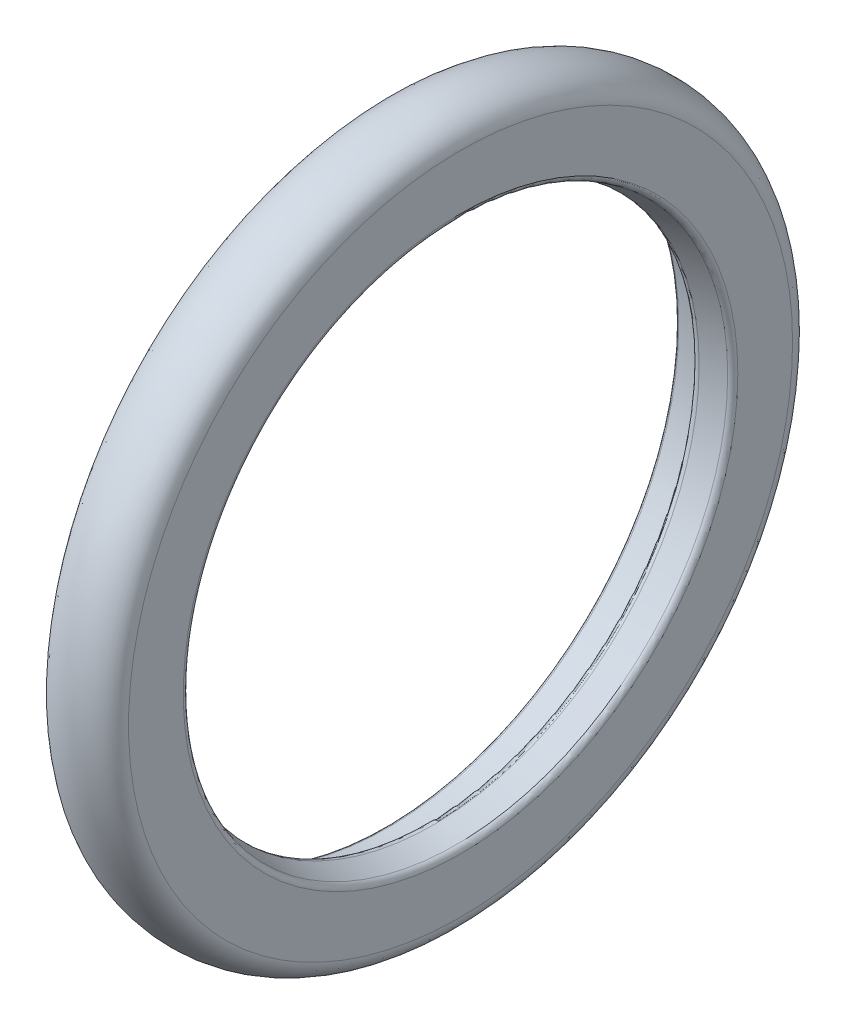
ISO-10303-21;
HEADER;
FILE_DESCRIPTION(('STEP AP214'),'2;1');
FILE_NAME('part.step','',(''),(''),'','','');
FILE_SCHEMA(('AUTOMOTIVE_DESIGN { 1 0 10303 214 1 1 1 1 }'));
ENDSEC;
DATA;
#1=APPLICATION_CONTEXT('core data for automotive mechanical design processes');
#2=APPLICATION_PROTOCOL_DEFINITION('international standard','automotive_design',2000,#1);
#3=PRODUCT_CONTEXT('',#1,'mechanical');
#4=PRODUCT('Part','Part','',(#3));
#5=PRODUCT_RELATED_PRODUCT_CATEGORY('part','',(#4));
#6=PRODUCT_DEFINITION_FORMATION('','',#4);
#7=PRODUCT_DEFINITION_CONTEXT('part definition',#1,'design');
#8=PRODUCT_DEFINITION('design','',#6,#7);
#9=PRODUCT_DEFINITION_SHAPE('','',#8);
#10=(LENGTH_UNIT() NAMED_UNIT(*) SI_UNIT(.MILLI.,.METRE.));
#11=(NAMED_UNIT(*) PLANE_ANGLE_UNIT() SI_UNIT($,.RADIAN.));
#12=(NAMED_UNIT(*) SI_UNIT($,.STERADIAN.) SOLID_ANGLE_UNIT());
#13=UNCERTAINTY_MEASURE_WITH_UNIT(LENGTH_MEASURE(1.E-05),#10,'distance_accuracy_value','');
#14=(GEOMETRIC_REPRESENTATION_CONTEXT(3) GLOBAL_UNCERTAINTY_ASSIGNED_CONTEXT((#13)) GLOBAL_UNIT_ASSIGNED_CONTEXT((#10,
#11,#12)) REPRESENTATION_CONTEXT('',''));
#15=CARTESIAN_POINT('',(0.,0.,0.));
#16=DIRECTION('',(0.,0.,1.));
#17=DIRECTION('',(1.,0.,0.));
#18=AXIS2_PLACEMENT_3D('',#15,#16,#17);
#19=CARTESIAN_POINT('',(-0.558663493989481,0.,0.));
#20=DIRECTION('',(1.,0.,0.));
#21=DIRECTION('',(0.,0.,-1.));
#22=AXIS2_PLACEMENT_3D('',#19,#20,#21);
#23=TOROIDAL_SURFACE('',#22,24.,0.5);
#24=CARTESIAN_POINT('',(-0.0757005808449396,0.,0.));
#25=DIRECTION('',(1.,0.,0.));
#26=DIRECTION('',(0.,0.,-1.));
#27=AXIS2_PLACEMENT_3D('',#24,#25,#26);
#28=CIRCLE('',#27,24.1294095225513);
#29=CARTESIAN_POINT('',(-0.0757005808449396,0.,-24.1294095225513));
#30=VERTEX_POINT('',#29);
#31=EDGE_CURVE('E86',#30,#30,#28,.T.);
#32=ORIENTED_EDGE('',*,*,#31,.T.);
#33=EDGE_LOOP('',(#32));
#34=FACE_BOUND('',#33,.T.);
#35=CARTESIAN_POINT('',(-0.558663493989489,0.,0.));
#36=DIRECTION('',(1.,0.,0.));
#37=DIRECTION('',(0.,0.,-1.));
#38=AXIS2_PLACEMENT_3D('',#35,#36,#37);
#39=CIRCLE('',#38,24.5);
#40=CARTESIAN_POINT('',(-0.558663493989489,0.,-24.5));
#41=VERTEX_POINT('',#40);
#42=EDGE_CURVE('E10',#41,#41,#39,.T.);
#43=ORIENTED_EDGE('',*,*,#42,.F.);
#44=EDGE_LOOP('',(#43));
#45=FACE_BOUND('',#44,.T.);
#46=ADVANCED_FACE('F43',(#34,#45),#23,.F.);
#47=CARTESIAN_POINT('',(88.99,0.,0.));
#48=DIRECTION('',(1.,0.,0.));
#49=DIRECTION('',(0.,0.,-1.));
#50=AXIS2_PLACEMENT_3D('',#47,#48,#49);
#51=CYLINDRICAL_SURFACE('',#50,24.5);
#52=ORIENTED_EDGE('',*,*,#42,.T.);
#53=EDGE_LOOP('',(#52));
#54=FACE_BOUND('',#53,.T.);
#55=CARTESIAN_POINT('',(-2.925,0.,0.));
#56=DIRECTION('',(1.,0.,0.));
#57=DIRECTION('',(0.,0.,-1.));
#58=AXIS2_PLACEMENT_3D('',#55,#56,#57);
#59=CIRCLE('',#58,24.5);
#60=CARTESIAN_POINT('',(-2.925,0.,-24.5));
#61=VERTEX_POINT('',#60);
#62=EDGE_CURVE('E50',#61,#61,#59,.T.);
#63=ORIENTED_EDGE('',*,*,#62,.F.);
#64=EDGE_LOOP('',(#63));
#65=FACE_BOUND('',#64,.T.);
#66=ADVANCED_FACE('F105',(#54,#65),#51,.F.);
#67=CARTESIAN_POINT('',(-2.925,0.,0.));
#68=DIRECTION('',(1.,0.,0.));
#69=DIRECTION('',(0.,0.,-1.));
#70=AXIS2_PLACEMENT_3D('',#67,#68,#69);
#71=TOROIDAL_SURFACE('',#70,24.75,0.25);
#72=ORIENTED_EDGE('',*,*,#62,.T.);
#73=EDGE_LOOP('',(#72));
#74=FACE_BOUND('',#73,.T.);
#75=CARTESIAN_POINT('',(-3.175,0.,0.));
#76=DIRECTION('',(1.,0.,0.));
#77=DIRECTION('',(0.,0.,-1.));
#78=AXIS2_PLACEMENT_3D('',#75,#76,#77);
#79=CIRCLE('',#78,24.75);
#80=CARTESIAN_POINT('',(-3.175,0.,-24.75));
#81=VERTEX_POINT('',#80);
#82=EDGE_CURVE('E55',#81,#81,#79,.T.);
#83=ORIENTED_EDGE('',*,*,#82,.F.);
#84=EDGE_LOOP('',(#83));
#85=FACE_BOUND('',#84,.T.);
#86=ADVANCED_FACE('F102',(#74,#85),#71,.T.);
#87=CARTESIAN_POINT('',(-3.175,0.,-28.));
#88=DIRECTION('',(-1.,0.,0.));
#89=DIRECTION('',(0.,0.,1.));
#90=AXIS2_PLACEMENT_3D('',#87,#88,#89);
#91=PLANE('',#90);
#92=ORIENTED_EDGE('',*,*,#82,.T.);
#93=EDGE_LOOP('',(#92));
#94=FACE_BOUND('',#93,.T.);
#95=CARTESIAN_POINT('',(-3.175,0.,0.));
#96=DIRECTION('',(1.,0.,0.));
#97=DIRECTION('',(0.,0.,-1.));
#98=AXIS2_PLACEMENT_3D('',#95,#96,#97);
#99=CIRCLE('',#98,28.);
#100=CARTESIAN_POINT('',(-3.175,0.,-28.));
#101=VERTEX_POINT('',#100);
#102=EDGE_CURVE('E60',#101,#101,#99,.T.);
#103=ORIENTED_EDGE('',*,*,#102,.F.);
#104=EDGE_LOOP('',(#103));
#105=FACE_BOUND('',#104,.T.);
#106=ADVANCED_FACE('F97',(#94,#105),#91,.T.);
#107=CARTESIAN_POINT('',(0.,0.,-28.));
#108=DIRECTION('',(0.,1.,0.));
#109=DIRECTION('',(1.,0.,0.));
#110=AXIS2_PLACEMENT_3D('',#107,#108,#109);
#111=ELLIPSE('',#110,3.175,2.);
#112=CARTESIAN_POINT('',(88.99,0.,0.));
#113=DIRECTION('',(1.,0.,0.));
#114=AXIS1_PLACEMENT('',#112,#113);
#115=SURFACE_OF_REVOLUTION('',#111,#114);
#116=ORIENTED_EDGE('',*,*,#102,.T.);
#117=EDGE_LOOP('',(#116));
#118=FACE_BOUND('',#117,.T.);
#119=CARTESIAN_POINT('',(3.175,0.,0.));
#120=DIRECTION('',(1.,0.,0.));
#121=DIRECTION('',(0.,0.,-1.));
#122=AXIS2_PLACEMENT_3D('',#119,#120,#121);
#123=CIRCLE('',#122,28.);
#124=CARTESIAN_POINT('',(3.175,0.,-28.));
#125=VERTEX_POINT('',#124);
#126=EDGE_CURVE('E66',#125,#125,#123,.T.);
#127=ORIENTED_EDGE('',*,*,#126,.F.);
#128=EDGE_LOOP('',(#127));
#129=FACE_BOUND('',#128,.T.);
#130=ADVANCED_FACE('F92',(#118,#129),#115,.F.);
#131=CARTESIAN_POINT('',(3.175,0.,-23.3836634939895));
#132=DIRECTION('',(1.,0.,0.));
#133=DIRECTION('',(0.,0.,-1.));
#134=AXIS2_PLACEMENT_3D('',#131,#132,#133);
#135=PLANE('',#134);
#136=ORIENTED_EDGE('',*,*,#126,.T.);
#137=EDGE_LOOP('',(#136));
#138=FACE_BOUND('',#137,.T.);
#139=CARTESIAN_POINT('',(3.175,0.,0.));
#140=DIRECTION('',(1.,0.,0.));
#141=DIRECTION('',(0.,0.,-1.));
#142=AXIS2_PLACEMENT_3D('',#139,#140,#141);
#143=CIRCLE('',#142,23.3836634939895);
#144=CARTESIAN_POINT('',(3.175,0.,-23.3836634939895));
#145=VERTEX_POINT('',#144);
#146=EDGE_CURVE('E70',#145,#145,#143,.T.);
#147=ORIENTED_EDGE('',*,*,#146,.F.);
#148=EDGE_LOOP('',(#147));
#149=FACE_BOUND('',#148,.T.);
#150=ADVANCED_FACE('F96',(#138,#149),#135,.T.);
#151=CARTESIAN_POINT('',(2.675,0.,0.));
#152=DIRECTION('',(1.,0.,0.));
#153=DIRECTION('',(0.,0.,-1.));
#154=AXIS2_PLACEMENT_3D('',#151,#152,#153);
#155=TOROIDAL_SURFACE('',#154,23.3836634939895,0.5);
#156=ORIENTED_EDGE('',*,*,#146,.T.);
#157=EDGE_LOOP('',(#156));
#158=FACE_BOUND('',#157,.T.);
#159=CARTESIAN_POINT('',(2.80440952255126,0.,0.));
#160=DIRECTION('',(1.,0.,0.));
#161=DIRECTION('',(0.,0.,-1.));
#162=AXIS2_PLACEMENT_3D('',#159,#160,#161);
#163=CIRCLE('',#162,22.9007005808449);
#164=CARTESIAN_POINT('',(2.80440952255126,0.,-22.9007005808449));
#165=VERTEX_POINT('',#164);
#166=EDGE_CURVE('E74',#165,#165,#163,.T.);
#167=ORIENTED_EDGE('',*,*,#166,.F.);
#168=EDGE_LOOP('',(#167));
#169=FACE_BOUND('',#168,.T.);
#170=ADVANCED_FACE('F130',(#158,#169),#155,.T.);
#171=CARTESIAN_POINT('',(0.90737036180559,0.,0.));
#172=DIRECTION('',(1.,0.,0.));
#173=DIRECTION('',(0.,0.,-1.));
#174=AXIS2_PLACEMENT_3D('',#171,#172,#173);
#175=CONICAL_SURFACE('',#174,22.3923904697129,0.261799387799145);
#176=ORIENTED_EDGE('',*,*,#166,.T.);
#177=EDGE_LOOP('',(#176));
#178=FACE_BOUND('',#177,.T.);
#179=CARTESIAN_POINT('',(0.90737036180559,0.,0.));
#180=DIRECTION('',(1.,0.,0.));
#181=DIRECTION('',(0.,0.,-1.));
#182=AXIS2_PLACEMENT_3D('',#179,#180,#181);
#183=CIRCLE('',#182,22.3923904697129);
#184=CARTESIAN_POINT('',(0.90737036180559,0.,-22.3923904697129));
#185=VERTEX_POINT('',#184);
#186=EDGE_CURVE('E78',#185,#185,#183,.T.);
#187=ORIENTED_EDGE('',*,*,#186,.F.);
#188=EDGE_LOOP('',(#187));
#189=FACE_BOUND('',#188,.T.);
#190=ADVANCED_FACE('F125',(#178,#189),#175,.F.);
#191=CARTESIAN_POINT('',(0.777960839254332,0.,0.));
#192=DIRECTION('',(1.,0.,0.));
#193=DIRECTION('',(0.,0.,-1.));
#194=AXIS2_PLACEMENT_3D('',#191,#192,#193);
#195=TOROIDAL_SURFACE('',#194,22.8753533828575,0.499999999999999);
#196=ORIENTED_EDGE('',*,*,#186,.T.);
#197=EDGE_LOOP('',(#196));
#198=FACE_BOUND('',#197,.T.);
#199=CARTESIAN_POINT('',(0.294997926109791,0.,0.));
#200=DIRECTION('',(1.,0.,0.));
#201=DIRECTION('',(0.,0.,-1.));
#202=AXIS2_PLACEMENT_3D('',#199,#200,#201);
#203=CIRCLE('',#202,22.7459438603062);
#204=CARTESIAN_POINT('',(0.294997926109791,0.,-22.7459438603062));
#205=VERTEX_POINT('',#204);
#206=EDGE_CURVE('E82',#205,#205,#203,.T.);
#207=ORIENTED_EDGE('',*,*,#206,.F.);
#208=EDGE_LOOP('',(#207));
#209=FACE_BOUND('',#208,.T.);
#210=ADVANCED_FACE('F119',(#198,#209),#195,.T.);
#211=CARTESIAN_POINT('',(-0.0757005808449396,0.,0.));
#212=DIRECTION('',(-1.,0.,0.));
#213=DIRECTION('',(0.,0.,1.));
#214=AXIS2_PLACEMENT_3D('',#211,#212,#213);
#215=CONICAL_SURFACE('',#214,24.1294095225513,1.30899693899576);
#216=ORIENTED_EDGE('',*,*,#206,.T.);
#217=EDGE_LOOP('',(#216));
#218=FACE_BOUND('',#217,.T.);
#219=ORIENTED_EDGE('',*,*,#31,.F.);
#220=EDGE_LOOP('',(#219));
#221=FACE_BOUND('',#220,.T.);
#222=ADVANCED_FACE('F117',(#218,#221),#215,.F.);
#223=CLOSED_SHELL('',(#46,#66,#86,#106,#130,#150,#170,#190,#210,#222));
#224=MANIFOLD_SOLID_BREP('B2',#223);
#225=ADVANCED_BREP_SHAPE_REPRESENTATION('',(#18,#224),#14);
#226=SHAPE_DEFINITION_REPRESENTATION(#9,#225);
ENDSEC;
END-ISO-10303-21;
